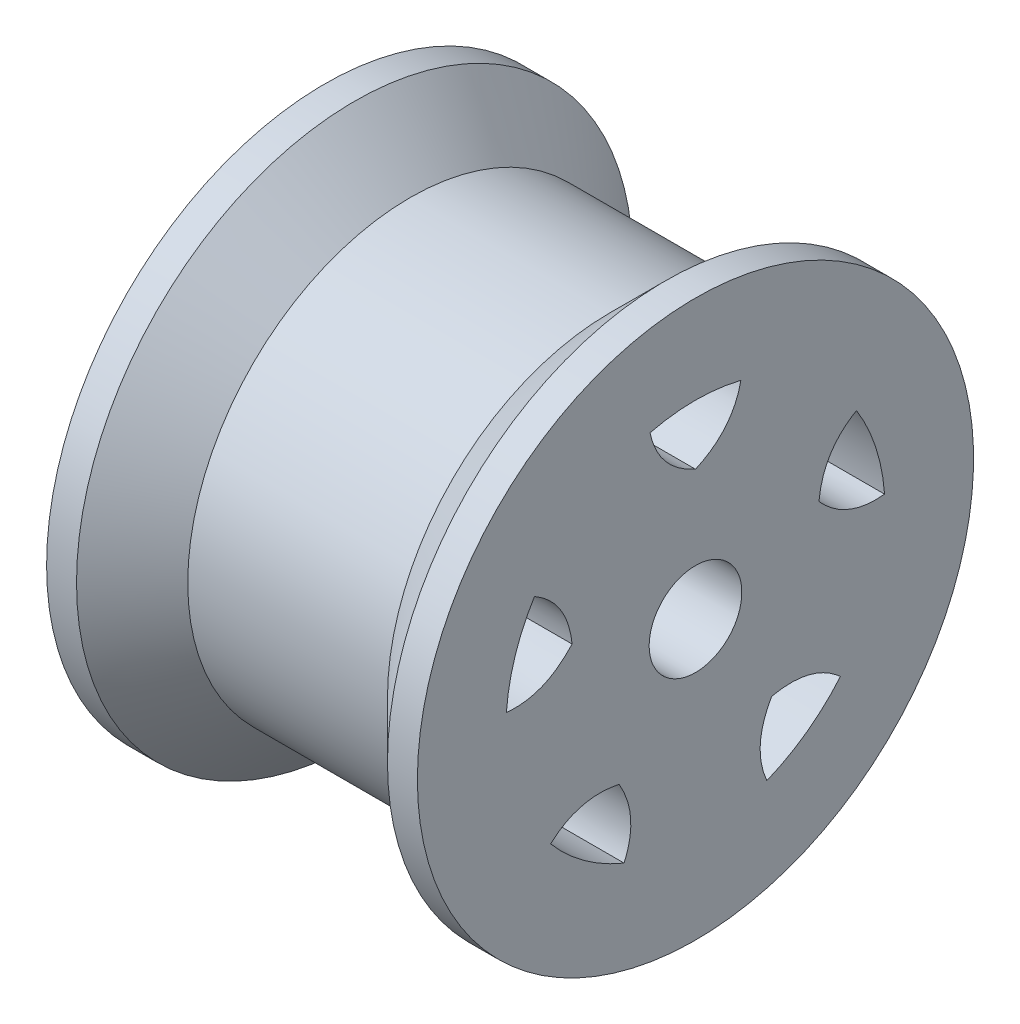
ISO-10303-21;
HEADER;
FILE_DESCRIPTION(('STEP AP214'),'2;1');
FILE_NAME('part.step','',(''),(''),'','','');
FILE_SCHEMA(('AUTOMOTIVE_DESIGN { 1 0 10303 214 1 1 1 1 }'));
ENDSEC;
DATA;
#1=APPLICATION_CONTEXT('core data for automotive mechanical design processes');
#2=APPLICATION_PROTOCOL_DEFINITION('international standard','automotive_design',2000,#1);
#3=PRODUCT_CONTEXT('',#1,'mechanical');
#4=PRODUCT('Part','Part','',(#3));
#5=PRODUCT_RELATED_PRODUCT_CATEGORY('part','',(#4));
#6=PRODUCT_DEFINITION_FORMATION('','',#4);
#7=PRODUCT_DEFINITION_CONTEXT('part definition',#1,'design');
#8=PRODUCT_DEFINITION('design','',#6,#7);
#9=PRODUCT_DEFINITION_SHAPE('','',#8);
#10=(LENGTH_UNIT() NAMED_UNIT(*) SI_UNIT(.MILLI.,.METRE.));
#11=(NAMED_UNIT(*) PLANE_ANGLE_UNIT() SI_UNIT($,.RADIAN.));
#12=(NAMED_UNIT(*) SI_UNIT($,.STERADIAN.) SOLID_ANGLE_UNIT());
#13=UNCERTAINTY_MEASURE_WITH_UNIT(LENGTH_MEASURE(1.E-05),#10,'distance_accuracy_value','');
#14=(GEOMETRIC_REPRESENTATION_CONTEXT(3) GLOBAL_UNCERTAINTY_ASSIGNED_CONTEXT((#13)) GLOBAL_UNIT_ASSIGNED_CONTEXT((#10,
#11,#12)) REPRESENTATION_CONTEXT('',''));
#15=CARTESIAN_POINT('',(0.,0.,0.));
#16=DIRECTION('',(0.,0.,1.));
#17=DIRECTION('',(1.,0.,0.));
#18=AXIS2_PLACEMENT_3D('',#15,#16,#17);
#19=CARTESIAN_POINT('',(2.,7.,0.));
#20=DIRECTION('',(1.,0.,0.));
#21=DIRECTION('',(0.,0.,-1.));
#22=AXIS2_PLACEMENT_3D('',#19,#20,#21);
#23=PLANE('',#22);
#24=CARTESIAN_POINT('',(2.,0.,0.));
#25=DIRECTION('',(-1.,0.,0.));
#26=DIRECTION('',(0.,0.,1.));
#27=AXIS2_PLACEMENT_3D('',#24,#25,#26);
#28=CIRCLE('',#27,7.);
#29=CARTESIAN_POINT('',(2.,2.1631189606247,6.65739561406603));
#30=VERTEX_POINT('',#29);
#31=CARTESIAN_POINT('',(2.,7.,0.));
#32=VERTEX_POINT('',#31);
#33=EDGE_CURVE('E151',#30,#32,#28,.T.);
#34=ORIENTED_EDGE('',*,*,#33,.F.);
#35=CARTESIAN_POINT('',(2.,5.39914971594777,8.68364783590195));
#36=CARTESIAN_POINT('',(2.,4.35907124753092,6.88593037319577));
#37=CARTESIAN_POINT('',(2.,2.1631189606247,6.65739561406603));
#38=B_SPLINE_CURVE_WITH_KNOTS('',2,(#35,#36,#37),.UNSPECIFIED.,.F.,.F.,(3,3),(0.,1.),.UNSPECIFIED.);
#39=CARTESIAN_POINT('',(2.,5.39914971594777,8.68364783590196));
#40=VERTEX_POINT('',#39);
#41=EDGE_CURVE('E130',#40,#30,#38,.T.);
#42=ORIENTED_EDGE('',*,*,#41,.F.);
#43=CARTESIAN_POINT('',(2.,0.,0.));
#44=DIRECTION('',(-1.,0.,0.));
#45=DIRECTION('',(0.,0.,1.));
#46=AXIS2_PLACEMENT_3D('',#43,#44,#45);
#47=CIRCLE('',#46,10.2252900884612);
#48=CARTESIAN_POINT('',(2.,9.92706887694942,2.4515017653442));
#49=VERTEX_POINT('',#48);
#50=EDGE_CURVE('E218',#40,#49,#47,.T.);
#51=ORIENTED_EDGE('',*,*,#50,.T.);
#52=CARTESIAN_POINT('',(2.,7.,0.));
#53=CARTESIAN_POINT('',(2.,7.89593604736084,2.01785360755892));
#54=CARTESIAN_POINT('',(2.,9.92706887694942,2.4515017653442));
#55=B_SPLINE_CURVE_WITH_KNOTS('',2,(#52,#53,#54),.UNSPECIFIED.,.F.,.F.,(3,3),(0.,1.),.UNSPECIFIED.);
#56=EDGE_CURVE('E153',#32,#49,#55,.T.);
#57=ORIENTED_EDGE('',*,*,#56,.F.);
#58=EDGE_LOOP('',(#34,#42,#51,#57));
#59=FACE_BOUND('',#58,.T.);
#60=ADVANCED_FACE('F17',(#59),#23,.F.);
#61=CARTESIAN_POINT('',(2.,-6.59021084214436,7.81829127426617));
#62=VERTEX_POINT('',#61);
#63=CARTESIAN_POINT('',(2.,0.736116258668438,10.1987592503651));
#64=VERTEX_POINT('',#63);
#65=EDGE_CURVE('E148',#62,#64,#47,.T.);
#66=ORIENTED_EDGE('',*,*,#65,.T.);
#67=CARTESIAN_POINT('',(2.,2.1631189606247,6.65739561406603));
#68=CARTESIAN_POINT('',(2.,0.520885602733746,8.13303248698882));
#69=CARTESIAN_POINT('',(2.,0.736116258668438,10.1987592503651));
#70=B_SPLINE_CURVE_WITH_KNOTS('',2,(#67,#68,#69),.UNSPECIFIED.,.F.,.F.,(3,3),(0.,1.),.UNSPECIFIED.);
#71=EDGE_CURVE('E39',#30,#64,#70,.T.);
#72=ORIENTED_EDGE('',*,*,#71,.F.);
#73=CARTESIAN_POINT('',(2.,-5.66311896062458,4.11449676604735));
#74=VERTEX_POINT('',#73);
#75=EDGE_CURVE('E145',#74,#30,#28,.T.);
#76=ORIENTED_EDGE('',*,*,#75,.F.);
#77=CARTESIAN_POINT('',(2.,-6.59021084214435,7.81829127426617));
#78=CARTESIAN_POINT('',(2.,-5.20188185700432,6.27359262235923));
#79=CARTESIAN_POINT('',(2.,-5.66311896062458,4.11449676604735));
#80=B_SPLINE_CURVE_WITH_KNOTS('',2,(#77,#78,#79),.UNSPECIFIED.,.F.,.F.,(3,3),(0.,1.),.UNSPECIFIED.);
#81=EDGE_CURVE('E251',#62,#74,#80,.T.);
#82=ORIENTED_EDGE('',*,*,#81,.F.);
#83=EDGE_LOOP('',(#66,#72,#76,#82));
#84=FACE_BOUND('',#83,.T.);
#85=ADVANCED_FACE('F142',(#84),#23,.F.);
#86=CARTESIAN_POINT('',(2.,-9.47212400942101,-3.85167809445878));
#87=VERTEX_POINT('',#86);
#88=CARTESIAN_POINT('',(2.,-9.47212400942095,3.85167809445892));
#89=VERTEX_POINT('',#88);
#90=EDGE_CURVE('E212',#87,#89,#47,.T.);
#91=ORIENTED_EDGE('',*,*,#90,.T.);
#92=CARTESIAN_POINT('',(2.,-5.66311896062458,4.11449676604735));
#93=CARTESIAN_POINT('',(2.,-7.57401104062094,3.00863690100732));
#94=CARTESIAN_POINT('',(2.,-9.47212400942096,3.85167809445892));
#95=B_SPLINE_CURVE_WITH_KNOTS('',2,(#92,#93,#94),.UNSPECIFIED.,.F.,.F.,(3,3),(0.,1.),.UNSPECIFIED.);
#96=EDGE_CURVE('E432',#74,#89,#95,.T.);
#97=ORIENTED_EDGE('',*,*,#96,.F.);
#98=CARTESIAN_POINT('',(2.,-5.66311896062464,-4.11449676604727));
#99=VERTEX_POINT('',#98);
#100=EDGE_CURVE('E164',#99,#74,#28,.T.);
#101=ORIENTED_EDGE('',*,*,#100,.F.);
#102=CARTESIAN_POINT('',(2.,-9.47212400942101,-3.85167809445878));
#103=CARTESIAN_POINT('',(2.,-7.57401104062098,-3.00863690100722));
#104=CARTESIAN_POINT('',(2.,-5.66311896062464,-4.11449676604727));
#105=B_SPLINE_CURVE_WITH_KNOTS('',2,(#102,#103,#104),.UNSPECIFIED.,.F.,.F.,(3,3),(0.,1.),.UNSPECIFIED.);
#106=EDGE_CURVE('E295',#87,#99,#105,.T.);
#107=ORIENTED_EDGE('',*,*,#106,.F.);
#108=EDGE_LOOP('',(#91,#97,#101,#107));
#109=FACE_BOUND('',#108,.T.);
#110=ADVANCED_FACE('F431',(#109),#23,.F.);
#111=CARTESIAN_POINT('',(2.,0.736116258668295,-10.1987592503651));
#112=VERTEX_POINT('',#111);
#113=CARTESIAN_POINT('',(2.,-6.59021084214447,-7.81829127426608));
#114=VERTEX_POINT('',#113);
#115=EDGE_CURVE('E208',#112,#114,#47,.T.);
#116=ORIENTED_EDGE('',*,*,#115,.T.);
#117=CARTESIAN_POINT('',(2.,-5.66311896062464,-4.11449676604727));
#118=CARTESIAN_POINT('',(2.,-5.20188185700441,-6.27359262235916));
#119=CARTESIAN_POINT('',(2.,-6.59021084214447,-7.81829127426608));
#120=B_SPLINE_CURVE_WITH_KNOTS('',2,(#117,#118,#119),.UNSPECIFIED.,.F.,.F.,(3,3),(0.,1.),.UNSPECIFIED.);
#121=EDGE_CURVE('E303',#99,#114,#120,.T.);
#122=ORIENTED_EDGE('',*,*,#121,.F.);
#123=CARTESIAN_POINT('',(2.,2.16311896062461,-6.65739561406606));
#124=VERTEX_POINT('',#123);
#125=EDGE_CURVE('E165',#124,#99,#28,.T.);
#126=ORIENTED_EDGE('',*,*,#125,.F.);
#127=CARTESIAN_POINT('',(2.,0.736116258668294,-10.1987592503651));
#128=CARTESIAN_POINT('',(2.,0.520885602733631,-8.13303248698883));
#129=CARTESIAN_POINT('',(2.,2.16311896062461,-6.65739561406606));
#130=B_SPLINE_CURVE_WITH_KNOTS('',2,(#127,#128,#129),.UNSPECIFIED.,.F.,.F.,(3,3),(0.,1.),.UNSPECIFIED.);
#131=EDGE_CURVE('E327',#112,#124,#130,.T.);
#132=ORIENTED_EDGE('',*,*,#131,.F.);
#133=EDGE_LOOP('',(#116,#122,#126,#132));
#134=FACE_BOUND('',#133,.T.);
#135=ADVANCED_FACE('F472',(#134),#23,.F.);
#136=CARTESIAN_POINT('',(2.,9.92706887694942,-2.4515017653442));
#137=VERTEX_POINT('',#136);
#138=CARTESIAN_POINT('',(2.,5.39914971594764,-8.68364783590203));
#139=VERTEX_POINT('',#138);
#140=EDGE_CURVE('E197',#137,#139,#47,.T.);
#141=ORIENTED_EDGE('',*,*,#140,.T.);
#142=CARTESIAN_POINT('',(2.,2.16311896062461,-6.65739561406606));
#143=CARTESIAN_POINT('',(2.,4.35907124753082,-6.88593037319584));
#144=CARTESIAN_POINT('',(2.,5.39914971594764,-8.68364783590203));
#145=B_SPLINE_CURVE_WITH_KNOTS('',2,(#142,#143,#144),.UNSPECIFIED.,.F.,.F.,(3,3),(0.,1.),.UNSPECIFIED.);
#146=EDGE_CURVE('E741',#124,#139,#145,.T.);
#147=ORIENTED_EDGE('',*,*,#146,.F.);
#148=EDGE_CURVE('E160',#32,#124,#28,.T.);
#149=ORIENTED_EDGE('',*,*,#148,.F.);
#150=CARTESIAN_POINT('',(2.,9.92706887694942,-2.4515017653442));
#151=CARTESIAN_POINT('',(2.,7.89593604736084,-2.01785360755892));
#152=CARTESIAN_POINT('',(2.,7.,0.));
#153=B_SPLINE_CURVE_WITH_KNOTS('',2,(#150,#151,#152),.UNSPECIFIED.,.F.,.F.,(3,3),(0.,1.),.UNSPECIFIED.);
#154=EDGE_CURVE('E383',#137,#32,#153,.T.);
#155=ORIENTED_EDGE('',*,*,#154,.F.);
#156=EDGE_LOOP('',(#141,#147,#149,#155));
#157=FACE_BOUND('',#156,.T.);
#158=ADVANCED_FACE('F413',(#157),#23,.F.);
#159=CARTESIAN_POINT('',(0.,0.,0.));
#160=DIRECTION('',(-1.,0.,0.));
#161=DIRECTION('',(0.,0.,1.));
#162=AXIS2_PLACEMENT_3D('',#159,#160,#161);
#163=CYLINDRICAL_SURFACE('',#162,15.);
#164=CARTESIAN_POINT('',(0.,0.,0.));
#165=DIRECTION('',(-1.,0.,0.));
#166=DIRECTION('',(0.,0.,1.));
#167=AXIS2_PLACEMENT_3D('',#164,#165,#166);
#168=CIRCLE('',#167,15.);
#169=CARTESIAN_POINT('',(0.,0.,15.));
#170=VERTEX_POINT('',#169);
#171=EDGE_CURVE('E390',#170,#170,#168,.T.);
#172=ORIENTED_EDGE('',*,*,#171,.F.);
#173=EDGE_LOOP('',(#172));
#174=FACE_BOUND('',#173,.T.);
#175=CARTESIAN_POINT('',(1.61417223726469,0.,0.));
#176=DIRECTION('',(-1.,0.,0.));
#177=DIRECTION('',(0.,0.,1.));
#178=AXIS2_PLACEMENT_3D('',#175,#176,#177);
#179=CIRCLE('',#178,15.);
#180=CARTESIAN_POINT('',(1.61417223726469,0.,15.));
#181=VERTEX_POINT('',#180);
#182=EDGE_CURVE('E191',#181,#181,#179,.T.);
#183=ORIENTED_EDGE('',*,*,#182,.T.);
#184=EDGE_LOOP('',(#183));
#185=FACE_BOUND('',#184,.T.);
#186=ADVANCED_FACE('F19',(#174,#185),#163,.T.);
#187=CARTESIAN_POINT('',(4.61417223726469,0.,0.));
#188=DIRECTION('',(-1.,0.,0.));
#189=DIRECTION('',(0.,0.,1.));
#190=AXIS2_PLACEMENT_3D('',#187,#188,#189);
#191=CONICAL_SURFACE('',#190,12.,0.78539816339745);
#192=ORIENTED_EDGE('',*,*,#182,.F.);
#193=EDGE_LOOP('',(#192));
#194=FACE_BOUND('',#193,.T.);
#195=CARTESIAN_POINT('',(4.61417223726469,0.,0.));
#196=DIRECTION('',(-1.,0.,0.));
#197=DIRECTION('',(0.,0.,1.));
#198=AXIS2_PLACEMENT_3D('',#195,#196,#197);
#199=CIRCLE('',#198,12.);
#200=CARTESIAN_POINT('',(4.61417223726469,0.,12.));
#201=VERTEX_POINT('',#200);
#202=EDGE_CURVE('E188',#201,#201,#199,.T.);
#203=ORIENTED_EDGE('',*,*,#202,.T.);
#204=EDGE_LOOP('',(#203));
#205=FACE_BOUND('',#204,.T.);
#206=ADVANCED_FACE('F478',(#194,#205),#191,.T.);
#207=CARTESIAN_POINT('',(0.,0.,0.));
#208=DIRECTION('',(-1.,0.,0.));
#209=DIRECTION('',(0.,0.,1.));
#210=AXIS2_PLACEMENT_3D('',#207,#208,#209);
#211=CYLINDRICAL_SURFACE('',#210,12.);
#212=ORIENTED_EDGE('',*,*,#202,.F.);
#213=EDGE_LOOP('',(#212));
#214=FACE_BOUND('',#213,.T.);
#215=CARTESIAN_POINT('',(15.3858277627353,0.,0.));
#216=DIRECTION('',(-1.,0.,0.));
#217=DIRECTION('',(0.,0.,1.));
#218=AXIS2_PLACEMENT_3D('',#215,#216,#217);
#219=CIRCLE('',#218,12.);
#220=CARTESIAN_POINT('',(15.3858277627353,0.,12.));
#221=VERTEX_POINT('',#220);
#222=EDGE_CURVE('E185',#221,#221,#219,.T.);
#223=ORIENTED_EDGE('',*,*,#222,.T.);
#224=EDGE_LOOP('',(#223));
#225=FACE_BOUND('',#224,.T.);
#226=ADVANCED_FACE('F525',(#214,#225),#211,.T.);
#227=CARTESIAN_POINT('',(18.3858277627353,0.,0.));
#228=DIRECTION('',(1.,0.,0.));
#229=DIRECTION('',(0.,0.,-1.));
#230=AXIS2_PLACEMENT_3D('',#227,#228,#229);
#231=CONICAL_SURFACE('',#230,15.,0.785398163397449);
#232=ORIENTED_EDGE('',*,*,#222,.F.);
#233=EDGE_LOOP('',(#232));
#234=FACE_BOUND('',#233,.T.);
#235=CARTESIAN_POINT('',(18.3858277627353,0.,0.));
#236=DIRECTION('',(-1.,0.,0.));
#237=DIRECTION('',(0.,0.,1.));
#238=AXIS2_PLACEMENT_3D('',#235,#236,#237);
#239=CIRCLE('',#238,15.);
#240=CARTESIAN_POINT('',(18.3858277627353,0.,15.));
#241=VERTEX_POINT('',#240);
#242=EDGE_CURVE('E182',#241,#241,#239,.T.);
#243=ORIENTED_EDGE('',*,*,#242,.T.);
#244=EDGE_LOOP('',(#243));
#245=FACE_BOUND('',#244,.T.);
#246=ADVANCED_FACE('F533',(#234,#245),#231,.T.);
#247=CARTESIAN_POINT('',(0.,0.,0.));
#248=DIRECTION('',(-1.,0.,0.));
#249=DIRECTION('',(0.,0.,1.));
#250=AXIS2_PLACEMENT_3D('',#247,#248,#249);
#251=CYLINDRICAL_SURFACE('',#250,15.);
#252=ORIENTED_EDGE('',*,*,#242,.F.);
#253=EDGE_LOOP('',(#252));
#254=FACE_BOUND('',#253,.T.);
#255=CARTESIAN_POINT('',(20.,0.,0.));
#256=DIRECTION('',(-1.,0.,0.));
#257=DIRECTION('',(0.,0.,1.));
#258=AXIS2_PLACEMENT_3D('',#255,#256,#257);
#259=CIRCLE('',#258,15.);
#260=CARTESIAN_POINT('',(20.,0.,15.));
#261=VERTEX_POINT('',#260);
#262=EDGE_CURVE('E179',#261,#261,#259,.T.);
#263=ORIENTED_EDGE('',*,*,#262,.T.);
#264=EDGE_LOOP('',(#263));
#265=FACE_BOUND('',#264,.T.);
#266=ADVANCED_FACE('F542',(#254,#265),#251,.T.);
#267=CARTESIAN_POINT('',(20.,15.,0.));
#268=DIRECTION('',(-1.,0.,0.));
#269=DIRECTION('',(0.,0.,1.));
#270=AXIS2_PLACEMENT_3D('',#267,#268,#269);
#271=PLANE('',#270);
#272=CARTESIAN_POINT('',(20.,0.,0.));
#273=DIRECTION('',(-1.,0.,0.));
#274=DIRECTION('',(0.,0.,1.));
#275=AXIS2_PLACEMENT_3D('',#272,#273,#274);
#276=CIRCLE('',#275,10.2252900884612);
#277=CARTESIAN_POINT('',(20.,0.736116258668438,10.1987592503651));
#278=VERTEX_POINT('',#277);
#279=CARTESIAN_POINT('',(20.,5.39914971594777,8.68364783590196));
#280=VERTEX_POINT('',#279);
#281=EDGE_CURVE('E246',#278,#280,#276,.T.);
#282=ORIENTED_EDGE('',*,*,#281,.T.);
#283=CARTESIAN_POINT('',(20.,5.39914971594777,8.68364783590195));
#284=CARTESIAN_POINT('',(20.,4.35907124753092,6.88593037319577));
#285=CARTESIAN_POINT('',(20.,2.1631189606247,6.65739561406603));
#286=B_SPLINE_CURVE_WITH_KNOTS('',2,(#283,#284,#285),.UNSPECIFIED.,.F.,.F.,(3,3),(0.,1.),.UNSPECIFIED.);
#287=CARTESIAN_POINT('',(20.,2.1631189606247,6.65739561406603));
#288=VERTEX_POINT('',#287);
#289=EDGE_CURVE('E11',#280,#288,#286,.T.);
#290=ORIENTED_EDGE('',*,*,#289,.T.);
#291=CARTESIAN_POINT('',(20.,2.1631189606247,6.65739561406603));
#292=CARTESIAN_POINT('',(20.,0.520885602733746,8.13303248698882));
#293=CARTESIAN_POINT('',(20.,0.736116258668438,10.1987592503651));
#294=B_SPLINE_CURVE_WITH_KNOTS('',2,(#291,#292,#293),.UNSPECIFIED.,.F.,.F.,(3,3),(0.,1.),.UNSPECIFIED.);
#295=EDGE_CURVE('E27',#288,#278,#294,.T.);
#296=ORIENTED_EDGE('',*,*,#295,.T.);
#297=EDGE_LOOP('',(#282,#290,#296));
#298=FACE_BOUND('',#297,.T.);
#299=CARTESIAN_POINT('',(20.,0.,0.));
#300=DIRECTION('',(-1.,0.,0.));
#301=DIRECTION('',(0.,0.,1.));
#302=AXIS2_PLACEMENT_3D('',#299,#300,#301);
#303=CIRCLE('',#302,10.2252900884612);
#304=CARTESIAN_POINT('',(20.,-9.47212400942096,3.85167809445892));
#305=VERTEX_POINT('',#304);
#306=CARTESIAN_POINT('',(20.,-6.59021084214436,7.81829127426617));
#307=VERTEX_POINT('',#306);
#308=EDGE_CURVE('E304',#305,#307,#303,.T.);
#309=ORIENTED_EDGE('',*,*,#308,.T.);
#310=CARTESIAN_POINT('',(20.,-6.59021084214435,7.81829127426617));
#311=CARTESIAN_POINT('',(20.,-5.20188185700432,6.27359262235923));
#312=CARTESIAN_POINT('',(20.,-5.66311896062458,4.11449676604735));
#313=B_SPLINE_CURVE_WITH_KNOTS('',2,(#310,#311,#312),.UNSPECIFIED.,.F.,.F.,(3,3),(0.,1.),.UNSPECIFIED.);
#314=CARTESIAN_POINT('',(20.,-5.66311896062458,4.11449676604735));
#315=VERTEX_POINT('',#314);
#316=EDGE_CURVE('E227',#307,#315,#313,.T.);
#317=ORIENTED_EDGE('',*,*,#316,.T.);
#318=CARTESIAN_POINT('',(20.,-5.66311896062458,4.11449676604735));
#319=CARTESIAN_POINT('',(20.,-7.57401104062094,3.00863690100732));
#320=CARTESIAN_POINT('',(20.,-9.47212400942096,3.85167809445892));
#321=B_SPLINE_CURVE_WITH_KNOTS('',2,(#318,#319,#320),.UNSPECIFIED.,.F.,.F.,(3,3),(0.,1.),.UNSPECIFIED.);
#322=EDGE_CURVE('E222',#315,#305,#321,.T.);
#323=ORIENTED_EDGE('',*,*,#322,.T.);
#324=EDGE_LOOP('',(#309,#317,#323));
#325=FACE_BOUND('',#324,.T.);
#326=CARTESIAN_POINT('',(20.,0.,0.));
#327=DIRECTION('',(-1.,0.,0.));
#328=DIRECTION('',(0.,0.,1.));
#329=AXIS2_PLACEMENT_3D('',#326,#327,#328);
#330=CIRCLE('',#329,10.2252900884612);
#331=CARTESIAN_POINT('',(20.,-6.59021084214447,-7.81829127426608));
#332=VERTEX_POINT('',#331);
#333=CARTESIAN_POINT('',(20.,-9.47212400942101,-3.85167809445878));
#334=VERTEX_POINT('',#333);
#335=EDGE_CURVE('E320',#332,#334,#330,.T.);
#336=ORIENTED_EDGE('',*,*,#335,.T.);
#337=CARTESIAN_POINT('',(20.,-9.47212400942101,-3.85167809445878));
#338=CARTESIAN_POINT('',(20.,-7.57401104062098,-3.00863690100722));
#339=CARTESIAN_POINT('',(20.,-5.66311896062464,-4.11449676604727));
#340=B_SPLINE_CURVE_WITH_KNOTS('',2,(#337,#338,#339),.UNSPECIFIED.,.F.,.F.,(3,3),(0.,1.),.UNSPECIFIED.);
#341=CARTESIAN_POINT('',(20.,-5.66311896062464,-4.11449676604727));
#342=VERTEX_POINT('',#341);
#343=EDGE_CURVE('E219',#334,#342,#340,.T.);
#344=ORIENTED_EDGE('',*,*,#343,.T.);
#345=CARTESIAN_POINT('',(20.,-5.66311896062464,-4.11449676604727));
#346=CARTESIAN_POINT('',(20.,-5.20188185700441,-6.27359262235916));
#347=CARTESIAN_POINT('',(20.,-6.59021084214447,-7.81829127426608));
#348=B_SPLINE_CURVE_WITH_KNOTS('',2,(#345,#346,#347),.UNSPECIFIED.,.F.,.F.,(3,3),(0.,1.),.UNSPECIFIED.);
#349=EDGE_CURVE('E737',#342,#332,#348,.T.);
#350=ORIENTED_EDGE('',*,*,#349,.T.);
#351=EDGE_LOOP('',(#336,#344,#350));
#352=FACE_BOUND('',#351,.T.);
#353=CARTESIAN_POINT('',(20.,0.,0.));
#354=DIRECTION('',(-1.,0.,0.));
#355=DIRECTION('',(0.,0.,1.));
#356=AXIS2_PLACEMENT_3D('',#353,#354,#355);
#357=CIRCLE('',#356,10.2252900884612);
#358=CARTESIAN_POINT('',(20.,5.39914971594764,-8.68364783590203));
#359=VERTEX_POINT('',#358);
#360=CARTESIAN_POINT('',(20.,0.736116258668295,-10.1987592503651));
#361=VERTEX_POINT('',#360);
#362=EDGE_CURVE('E385',#359,#361,#357,.T.);
#363=ORIENTED_EDGE('',*,*,#362,.T.);
#364=CARTESIAN_POINT('',(20.,0.736116258668294,-10.1987592503651));
#365=CARTESIAN_POINT('',(20.,0.520885602733631,-8.13303248698883));
#366=CARTESIAN_POINT('',(20.,2.16311896062461,-6.65739561406606));
#367=B_SPLINE_CURVE_WITH_KNOTS('',2,(#364,#365,#366),.UNSPECIFIED.,.F.,.F.,(3,3),(0.,1.),.UNSPECIFIED.);
#368=CARTESIAN_POINT('',(20.,2.16311896062461,-6.65739561406606));
#369=VERTEX_POINT('',#368);
#370=EDGE_CURVE('E767',#361,#369,#367,.T.);
#371=ORIENTED_EDGE('',*,*,#370,.T.);
#372=CARTESIAN_POINT('',(20.,2.16311896062461,-6.65739561406606));
#373=CARTESIAN_POINT('',(20.,4.35907124753082,-6.88593037319584));
#374=CARTESIAN_POINT('',(20.,5.39914971594764,-8.68364783590203));
#375=B_SPLINE_CURVE_WITH_KNOTS('',2,(#372,#373,#374),.UNSPECIFIED.,.F.,.F.,(3,3),(0.,1.),.UNSPECIFIED.);
#376=EDGE_CURVE('E194',#369,#359,#375,.T.);
#377=ORIENTED_EDGE('',*,*,#376,.T.);
#378=EDGE_LOOP('',(#363,#371,#377));
#379=FACE_BOUND('',#378,.T.);
#380=CARTESIAN_POINT('',(20.,0.,0.));
#381=DIRECTION('',(-1.,0.,0.));
#382=DIRECTION('',(0.,0.,1.));
#383=AXIS2_PLACEMENT_3D('',#380,#381,#382);
#384=CIRCLE('',#383,10.2252900884612);
#385=CARTESIAN_POINT('',(20.,9.92706887694942,2.4515017653442));
#386=VERTEX_POINT('',#385);
#387=CARTESIAN_POINT('',(20.,9.92706887694942,-2.4515017653442));
#388=VERTEX_POINT('',#387);
#389=EDGE_CURVE('E364',#386,#388,#384,.T.);
#390=ORIENTED_EDGE('',*,*,#389,.T.);
#391=CARTESIAN_POINT('',(20.,9.92706887694942,-2.4515017653442));
#392=CARTESIAN_POINT('',(20.,7.89593604736084,-2.01785360755892));
#393=CARTESIAN_POINT('',(20.,7.,0.));
#394=B_SPLINE_CURVE_WITH_KNOTS('',2,(#391,#392,#393),.UNSPECIFIED.,.F.,.F.,(3,3),(0.,1.),.UNSPECIFIED.);
#395=CARTESIAN_POINT('',(20.,7.,0.));
#396=VERTEX_POINT('',#395);
#397=EDGE_CURVE('E365',#388,#396,#394,.T.);
#398=ORIENTED_EDGE('',*,*,#397,.T.);
#399=CARTESIAN_POINT('',(20.,7.,0.));
#400=CARTESIAN_POINT('',(20.,7.89593604736084,2.01785360755892));
#401=CARTESIAN_POINT('',(20.,9.92706887694942,2.4515017653442));
#402=B_SPLINE_CURVE_WITH_KNOTS('',2,(#399,#400,#401),.UNSPECIFIED.,.F.,.F.,(3,3),(0.,1.),.UNSPECIFIED.);
#403=EDGE_CURVE('E358',#396,#386,#402,.T.);
#404=ORIENTED_EDGE('',*,*,#403,.T.);
#405=EDGE_LOOP('',(#390,#398,#404));
#406=FACE_BOUND('',#405,.T.);
#407=ORIENTED_EDGE('',*,*,#262,.F.);
#408=EDGE_LOOP('',(#407));
#409=FACE_BOUND('',#408,.T.);
#410=CARTESIAN_POINT('',(20.,0.,0.));
#411=DIRECTION('',(-1.,0.,0.));
#412=DIRECTION('',(0.,0.,1.));
#413=AXIS2_PLACEMENT_3D('',#410,#411,#412);
#414=CIRCLE('',#413,2.5);
#415=CARTESIAN_POINT('',(20.,0.,2.5));
#416=VERTEX_POINT('',#415);
#417=EDGE_CURVE('E176',#416,#416,#414,.T.);
#418=ORIENTED_EDGE('',*,*,#417,.T.);
#419=EDGE_LOOP('',(#418));
#420=FACE_BOUND('',#419,.T.);
#421=ADVANCED_FACE('F244',(#298,#325,#352,#379,#406,#409,#420),#271,.F.);
#422=CARTESIAN_POINT('',(0.,0.,0.));
#423=DIRECTION('',(-1.,0.,0.));
#424=DIRECTION('',(0.,0.,1.));
#425=AXIS2_PLACEMENT_3D('',#422,#423,#424);
#426=CYLINDRICAL_SURFACE('',#425,2.5);
#427=ORIENTED_EDGE('',*,*,#417,.F.);
#428=EDGE_LOOP('',(#427));
#429=FACE_BOUND('',#428,.T.);
#430=CARTESIAN_POINT('',(0.,0.,0.));
#431=DIRECTION('',(-1.,0.,0.));
#432=DIRECTION('',(0.,0.,1.));
#433=AXIS2_PLACEMENT_3D('',#430,#431,#432);
#434=CIRCLE('',#433,2.5);
#435=CARTESIAN_POINT('',(0.,0.,2.5));
#436=VERTEX_POINT('',#435);
#437=EDGE_CURVE('E173',#436,#436,#434,.T.);
#438=ORIENTED_EDGE('',*,*,#437,.T.);
#439=EDGE_LOOP('',(#438));
#440=FACE_BOUND('',#439,.T.);
#441=ADVANCED_FACE('F559',(#429,#440),#426,.F.);
#442=CARTESIAN_POINT('',(0.,2.5,0.));
#443=DIRECTION('',(1.,0.,0.));
#444=DIRECTION('',(0.,0.,-1.));
#445=AXIS2_PLACEMENT_3D('',#442,#443,#444);
#446=PLANE('',#445);
#447=ORIENTED_EDGE('',*,*,#437,.F.);
#448=EDGE_LOOP('',(#447));
#449=FACE_BOUND('',#448,.T.);
#450=CARTESIAN_POINT('',(0.,0.,0.));
#451=DIRECTION('',(-1.,0.,0.));
#452=DIRECTION('',(0.,0.,1.));
#453=AXIS2_PLACEMENT_3D('',#450,#451,#452);
#454=CIRCLE('',#453,5.);
#455=CARTESIAN_POINT('',(0.,0.,5.));
#456=VERTEX_POINT('',#455);
#457=EDGE_CURVE('E168',#456,#456,#454,.T.);
#458=ORIENTED_EDGE('',*,*,#457,.T.);
#459=EDGE_LOOP('',(#458));
#460=FACE_BOUND('',#459,.T.);
#461=ADVANCED_FACE('F567',(#449,#460),#446,.F.);
#462=CARTESIAN_POINT('',(2.,0.,0.));
#463=DIRECTION('',(1.,0.,0.));
#464=DIRECTION('',(0.,0.,-1.));
#465=AXIS2_PLACEMENT_3D('',#462,#463,#464);
#466=CONICAL_SURFACE('',#465,7.,0.785398163397443);
#467=ORIENTED_EDGE('',*,*,#457,.F.);
#468=EDGE_LOOP('',(#467));
#469=FACE_BOUND('',#468,.T.);
#470=ORIENTED_EDGE('',*,*,#148,.T.);
#471=ORIENTED_EDGE('',*,*,#125,.T.);
#472=ORIENTED_EDGE('',*,*,#100,.T.);
#473=ORIENTED_EDGE('',*,*,#75,.T.);
#474=ORIENTED_EDGE('',*,*,#33,.T.);
#475=EDGE_LOOP('',(#470,#471,#472,#473,#474));
#476=FACE_BOUND('',#475,.T.);
#477=ADVANCED_FACE('F161',(#469,#476),#466,.T.);
#478=CARTESIAN_POINT('',(0.,0.,0.));
#479=DIRECTION('',(-1.,0.,0.));
#480=DIRECTION('',(0.,0.,1.));
#481=AXIS2_PLACEMENT_3D('',#478,#479,#480);
#482=CONICAL_SURFACE('',#481,12.2252900884612,0.78539816339745);
#483=EDGE_CURVE('E158',#49,#137,#47,.T.);
#484=ORIENTED_EDGE('',*,*,#483,.F.);
#485=ORIENTED_EDGE('',*,*,#50,.F.);
#486=CARTESIAN_POINT('',(2.,0.,0.));
#487=DIRECTION('',(-1.,0.,0.));
#488=DIRECTION('',(0.,-0.95105651629515,0.309016994374958));
#489=AXIS2_PLACEMENT_3D('',#486,#487,#488);
#490=CIRCLE('',#489,10.2252900884612);
#491=EDGE_CURVE('E127',#64,#40,#490,.T.);
#492=ORIENTED_EDGE('',*,*,#491,.F.);
#493=ORIENTED_EDGE('',*,*,#65,.F.);
#494=CARTESIAN_POINT('',(2.,0.,0.));
#495=DIRECTION('',(-1.,0.,0.));
#496=DIRECTION('',(0.,-0.58778525229248,-0.809016994374942));
#497=AXIS2_PLACEMENT_3D('',#494,#495,#496);
#498=CIRCLE('',#497,10.2252900884612);
#499=EDGE_CURVE('E436',#89,#62,#498,.T.);
#500=ORIENTED_EDGE('',*,*,#499,.F.);
#501=ORIENTED_EDGE('',*,*,#90,.F.);
#502=CARTESIAN_POINT('',(2.,0.,0.));
#503=DIRECTION('',(-1.,0.,0.));
#504=DIRECTION('',(0.,0.587785252292469,-0.809016994374951));
#505=AXIS2_PLACEMENT_3D('',#502,#503,#504);
#506=CIRCLE('',#505,10.2252900884612);
#507=EDGE_CURVE('E311',#114,#87,#506,.T.);
#508=ORIENTED_EDGE('',*,*,#507,.F.);
#509=ORIENTED_EDGE('',*,*,#115,.F.);
#510=CARTESIAN_POINT('',(2.,0.,0.));
#511=DIRECTION('',(-1.,0.,0.));
#512=DIRECTION('',(0.,0.951056516295155,0.309016994374945));
#513=AXIS2_PLACEMENT_3D('',#510,#511,#512);
#514=CIRCLE('',#513,10.2252900884612);
#515=EDGE_CURVE('E421',#139,#112,#514,.T.);
#516=ORIENTED_EDGE('',*,*,#515,.F.);
#517=ORIENTED_EDGE('',*,*,#140,.F.);
#518=EDGE_LOOP('',(#484,#485,#492,#493,#500,#501,#508,#509,#516,#517));
#519=FACE_BOUND('',#518,.T.);
#520=CARTESIAN_POINT('',(0.,0.,0.));
#521=DIRECTION('',(-1.,0.,0.));
#522=DIRECTION('',(0.,0.,1.));
#523=AXIS2_PLACEMENT_3D('',#520,#521,#522);
#524=CIRCLE('',#523,12.2252900884612);
#525=CARTESIAN_POINT('',(0.,0.,12.2252900884612));
#526=VERTEX_POINT('',#525);
#527=EDGE_CURVE('E169',#526,#526,#524,.T.);
#528=ORIENTED_EDGE('',*,*,#527,.T.);
#529=EDGE_LOOP('',(#528));
#530=FACE_BOUND('',#529,.T.);
#531=ADVANCED_FACE('F417',(#519,#530),#482,.F.);
#532=CARTESIAN_POINT('',(0.,12.2252900884612,0.));
#533=DIRECTION('',(1.,0.,0.));
#534=DIRECTION('',(0.,0.,-1.));
#535=AXIS2_PLACEMENT_3D('',#532,#533,#534);
#536=PLANE('',#535);
#537=ORIENTED_EDGE('',*,*,#527,.F.);
#538=EDGE_LOOP('',(#537));
#539=FACE_BOUND('',#538,.T.);
#540=ORIENTED_EDGE('',*,*,#171,.T.);
#541=EDGE_LOOP('',(#540));
#542=FACE_BOUND('',#541,.T.);
#543=ADVANCED_FACE('F591',(#539,#542),#536,.F.);
#544=DIRECTION('',(-1.,0.,0.));
#545=VECTOR('',#544,1.);
#546=SURFACE_OF_LINEAR_EXTRUSION('',#394,#545);
#547=ORIENTED_EDGE('',*,*,#154,.T.);
#548=DIRECTION('',(-1.,0.,0.));
#549=VECTOR('',#548,1.);
#550=CARTESIAN_POINT('',(20.,7.,0.));
#551=LINE('',#550,#549);
#552=EDGE_CURVE('E375',#396,#32,#551,.T.);
#553=ORIENTED_EDGE('',*,*,#552,.F.);
#554=ORIENTED_EDGE('',*,*,#397,.F.);
#555=DIRECTION('',(-1.,0.,0.));
#556=VECTOR('',#555,1.);
#557=CARTESIAN_POINT('',(20.,9.92706887694942,-2.4515017653442));
#558=LINE('',#557,#556);
#559=EDGE_CURVE('E388',#388,#137,#558,.T.);
#560=ORIENTED_EDGE('',*,*,#559,.T.);
#561=EDGE_LOOP('',(#547,#553,#554,#560));
#562=FACE_BOUND('',#561,.T.);
#563=ADVANCED_FACE('F350',(#562),#546,.F.);
#564=CARTESIAN_POINT('',(20.,0.,0.));
#565=DIRECTION('',(-1.,0.,0.));
#566=DIRECTION('',(0.,0.,1.));
#567=AXIS2_PLACEMENT_3D('',#564,#565,#566);
#568=CYLINDRICAL_SURFACE('',#567,10.2252900884612);
#569=ORIENTED_EDGE('',*,*,#483,.T.);
#570=ORIENTED_EDGE('',*,*,#559,.F.);
#571=ORIENTED_EDGE('',*,*,#389,.F.);
#572=DIRECTION('',(-1.,0.,0.));
#573=VECTOR('',#572,1.);
#574=CARTESIAN_POINT('',(20.,9.92706887694942,2.4515017653442));
#575=LINE('',#574,#573);
#576=EDGE_CURVE('E391',#386,#49,#575,.T.);
#577=ORIENTED_EDGE('',*,*,#576,.T.);
#578=EDGE_LOOP('',(#569,#570,#571,#577));
#579=FACE_BOUND('',#578,.T.);
#580=ADVANCED_FACE('F347',(#579),#568,.F.);
#581=DIRECTION('',(-1.,0.,0.));
#582=VECTOR('',#581,1.);
#583=SURFACE_OF_LINEAR_EXTRUSION('',#402,#582);
#584=ORIENTED_EDGE('',*,*,#56,.T.);
#585=ORIENTED_EDGE('',*,*,#576,.F.);
#586=ORIENTED_EDGE('',*,*,#403,.F.);
#587=ORIENTED_EDGE('',*,*,#552,.T.);
#588=EDGE_LOOP('',(#584,#585,#586,#587));
#589=FACE_BOUND('',#588,.T.);
#590=ADVANCED_FACE('F345',(#589),#583,.F.);
#591=CARTESIAN_POINT('',(20.000025,0.736116258668294,-10.1987592503651));
#592=CARTESIAN_POINT('',(20.000025,0.520885602733631,-8.13303248698883));
#593=CARTESIAN_POINT('',(20.000025,2.16311896062461,-6.65739561406606));
#594=B_SPLINE_CURVE_WITH_KNOTS('',2,(#591,#592,#593),.UNSPECIFIED.,.F.,.F.,(3,3),(0.,1.),.UNSPECIFIED.);
#595=DIRECTION('',(-1.,0.,0.));
#596=VECTOR('',#595,1.);
#597=SURFACE_OF_LINEAR_EXTRUSION('',#594,#596);
#598=DIRECTION('',(-1.,0.,0.));
#599=VECTOR('',#598,1.);
#600=CARTESIAN_POINT('',(20.000025,0.736116258668295,-10.1987592503651));
#601=LINE('',#600,#599);
#602=EDGE_CURVE('E756',#361,#112,#601,.T.);
#603=ORIENTED_EDGE('',*,*,#602,.T.);
#604=ORIENTED_EDGE('',*,*,#131,.T.);
#605=DIRECTION('',(-1.,0.,0.));
#606=VECTOR('',#605,1.);
#607=CARTESIAN_POINT('',(20.000025,2.16311896062461,-6.65739561406606));
#608=LINE('',#607,#606);
#609=EDGE_CURVE('E755',#369,#124,#608,.T.);
#610=ORIENTED_EDGE('',*,*,#609,.F.);
#611=ORIENTED_EDGE('',*,*,#370,.F.);
#612=EDGE_LOOP('',(#603,#604,#610,#611));
#613=FACE_BOUND('',#612,.T.);
#614=ADVANCED_FACE('F340',(#613),#597,.F.);
#615=CARTESIAN_POINT('',(20.000025,2.16311896062461,-6.65739561406606));
#616=CARTESIAN_POINT('',(20.000025,4.35907124753082,-6.88593037319584));
#617=CARTESIAN_POINT('',(20.000025,5.39914971594764,-8.68364783590203));
#618=B_SPLINE_CURVE_WITH_KNOTS('',2,(#615,#616,#617),.UNSPECIFIED.,.F.,.F.,(3,3),(0.,1.),.UNSPECIFIED.);
#619=DIRECTION('',(-1.,0.,0.));
#620=VECTOR('',#619,1.);
#621=SURFACE_OF_LINEAR_EXTRUSION('',#618,#620);
#622=ORIENTED_EDGE('',*,*,#609,.T.);
#623=ORIENTED_EDGE('',*,*,#146,.T.);
#624=DIRECTION('',(-1.,0.,0.));
#625=VECTOR('',#624,1.);
#626=CARTESIAN_POINT('',(20.000025,5.39914971594764,-8.68364783590203));
#627=LINE('',#626,#625);
#628=EDGE_CURVE('E758',#359,#139,#627,.T.);
#629=ORIENTED_EDGE('',*,*,#628,.F.);
#630=ORIENTED_EDGE('',*,*,#376,.F.);
#631=EDGE_LOOP('',(#622,#623,#629,#630));
#632=FACE_BOUND('',#631,.T.);
#633=ADVANCED_FACE('F344',(#632),#621,.F.);
#634=CARTESIAN_POINT('',(20.000025,0.,0.));
#635=DIRECTION('',(-1.,0.,0.));
#636=DIRECTION('',(0.,0.,1.));
#637=AXIS2_PLACEMENT_3D('',#634,#635,#636);
#638=CYLINDRICAL_SURFACE('',#637,10.2252900884612);
#639=ORIENTED_EDGE('',*,*,#628,.T.);
#640=ORIENTED_EDGE('',*,*,#515,.T.);
#641=ORIENTED_EDGE('',*,*,#602,.F.);
#642=ORIENTED_EDGE('',*,*,#362,.F.);
#643=EDGE_LOOP('',(#639,#640,#641,#642));
#644=FACE_BOUND('',#643,.T.);
#645=ADVANCED_FACE('F625',(#644),#638,.F.);
#646=CARTESIAN_POINT('',(20.000025,-9.47212400942101,-3.85167809445878));
#647=CARTESIAN_POINT('',(20.000025,-7.57401104062098,-3.00863690100722));
#648=CARTESIAN_POINT('',(20.000025,-5.66311896062464,-4.11449676604727));
#649=B_SPLINE_CURVE_WITH_KNOTS('',2,(#646,#647,#648),.UNSPECIFIED.,.F.,.F.,(3,3),(0.,1.),.UNSPECIFIED.);
#650=DIRECTION('',(-1.,0.,0.));
#651=VECTOR('',#650,1.);
#652=SURFACE_OF_LINEAR_EXTRUSION('',#649,#651);
#653=DIRECTION('',(-1.,0.,0.));
#654=VECTOR('',#653,1.);
#655=CARTESIAN_POINT('',(20.000025,-9.47212400942101,-3.85167809445878));
#656=LINE('',#655,#654);
#657=EDGE_CURVE('E318',#334,#87,#656,.T.);
#658=ORIENTED_EDGE('',*,*,#657,.T.);
#659=ORIENTED_EDGE('',*,*,#106,.T.);
#660=DIRECTION('',(-1.,0.,0.));
#661=VECTOR('',#660,1.);
#662=CARTESIAN_POINT('',(20.000025,-5.66311896062464,-4.11449676604727));
#663=LINE('',#662,#661);
#664=EDGE_CURVE('E317',#342,#99,#663,.T.);
#665=ORIENTED_EDGE('',*,*,#664,.F.);
#666=ORIENTED_EDGE('',*,*,#343,.F.);
#667=EDGE_LOOP('',(#658,#659,#665,#666));
#668=FACE_BOUND('',#667,.T.);
#669=ADVANCED_FACE('F283',(#668),#652,.F.);
#670=CARTESIAN_POINT('',(20.000025,-5.66311896062464,-4.11449676604727));
#671=CARTESIAN_POINT('',(20.000025,-5.20188185700441,-6.27359262235916));
#672=CARTESIAN_POINT('',(20.000025,-6.59021084214447,-7.81829127426608));
#673=B_SPLINE_CURVE_WITH_KNOTS('',2,(#670,#671,#672),.UNSPECIFIED.,.F.,.F.,(3,3),(0.,1.),.UNSPECIFIED.);
#674=DIRECTION('',(-1.,0.,0.));
#675=VECTOR('',#674,1.);
#676=SURFACE_OF_LINEAR_EXTRUSION('',#673,#675);
#677=ORIENTED_EDGE('',*,*,#664,.T.);
#678=ORIENTED_EDGE('',*,*,#121,.T.);
#679=DIRECTION('',(-1.,0.,0.));
#680=VECTOR('',#679,1.);
#681=CARTESIAN_POINT('',(20.000025,-6.59021084214447,-7.81829127426608));
#682=LINE('',#681,#680);
#683=EDGE_CURVE('E321',#332,#114,#682,.T.);
#684=ORIENTED_EDGE('',*,*,#683,.F.);
#685=ORIENTED_EDGE('',*,*,#349,.F.);
#686=EDGE_LOOP('',(#677,#678,#684,#685));
#687=FACE_BOUND('',#686,.T.);
#688=ADVANCED_FACE('F278',(#687),#676,.F.);
#689=CARTESIAN_POINT('',(20.000025,0.,0.));
#690=DIRECTION('',(-1.,0.,0.));
#691=DIRECTION('',(0.,0.,1.));
#692=AXIS2_PLACEMENT_3D('',#689,#690,#691);
#693=CYLINDRICAL_SURFACE('',#692,10.2252900884612);
#694=ORIENTED_EDGE('',*,*,#683,.T.);
#695=ORIENTED_EDGE('',*,*,#507,.T.);
#696=ORIENTED_EDGE('',*,*,#657,.F.);
#697=ORIENTED_EDGE('',*,*,#335,.F.);
#698=EDGE_LOOP('',(#694,#695,#696,#697));
#699=FACE_BOUND('',#698,.T.);
#700=ADVANCED_FACE('F273',(#699),#693,.F.);
#701=CARTESIAN_POINT('',(20.000025,-6.59021084214435,7.81829127426617));
#702=CARTESIAN_POINT('',(20.000025,-5.20188185700432,6.27359262235923));
#703=CARTESIAN_POINT('',(20.000025,-5.66311896062458,4.11449676604735));
#704=B_SPLINE_CURVE_WITH_KNOTS('',2,(#701,#702,#703),.UNSPECIFIED.,.F.,.F.,(3,3),(0.,1.),.UNSPECIFIED.);
#705=DIRECTION('',(-1.,0.,0.));
#706=VECTOR('',#705,1.);
#707=SURFACE_OF_LINEAR_EXTRUSION('',#704,#706);
#708=DIRECTION('',(-1.,0.,0.));
#709=VECTOR('',#708,1.);
#710=CARTESIAN_POINT('',(20.000025,-6.59021084214436,7.81829127426617));
#711=LINE('',#710,#709);
#712=EDGE_CURVE('E448',#307,#62,#711,.T.);
#713=ORIENTED_EDGE('',*,*,#712,.T.);
#714=ORIENTED_EDGE('',*,*,#81,.T.);
#715=DIRECTION('',(-1.,0.,0.));
#716=VECTOR('',#715,1.);
#717=CARTESIAN_POINT('',(20.000025,-5.66311896062458,4.11449676604735));
#718=LINE('',#717,#716);
#719=EDGE_CURVE('E440',#315,#74,#718,.T.);
#720=ORIENTED_EDGE('',*,*,#719,.F.);
#721=ORIENTED_EDGE('',*,*,#316,.F.);
#722=EDGE_LOOP('',(#713,#714,#720,#721));
#723=FACE_BOUND('',#722,.T.);
#724=ADVANCED_FACE('F268',(#723),#707,.F.);
#725=CARTESIAN_POINT('',(20.000025,-5.66311896062458,4.11449676604735));
#726=CARTESIAN_POINT('',(20.000025,-7.57401104062094,3.00863690100732));
#727=CARTESIAN_POINT('',(20.000025,-9.47212400942096,3.85167809445892));
#728=B_SPLINE_CURVE_WITH_KNOTS('',2,(#725,#726,#727),.UNSPECIFIED.,.F.,.F.,(3,3),(0.,1.),.UNSPECIFIED.);
#729=DIRECTION('',(-1.,0.,0.));
#730=VECTOR('',#729,1.);
#731=SURFACE_OF_LINEAR_EXTRUSION('',#728,#730);
#732=ORIENTED_EDGE('',*,*,#719,.T.);
#733=ORIENTED_EDGE('',*,*,#96,.T.);
#734=DIRECTION('',(-1.,0.,0.));
#735=VECTOR('',#734,1.);
#736=CARTESIAN_POINT('',(20.000025,-9.47212400942096,3.85167809445892));
#737=LINE('',#736,#735);
#738=EDGE_CURVE('E442',#305,#89,#737,.T.);
#739=ORIENTED_EDGE('',*,*,#738,.F.);
#740=ORIENTED_EDGE('',*,*,#322,.F.);
#741=EDGE_LOOP('',(#732,#733,#739,#740));
#742=FACE_BOUND('',#741,.T.);
#743=ADVANCED_FACE('F272',(#742),#731,.F.);
#744=CARTESIAN_POINT('',(20.000025,0.,0.));
#745=DIRECTION('',(-1.,0.,0.));
#746=DIRECTION('',(0.,0.,1.));
#747=AXIS2_PLACEMENT_3D('',#744,#745,#746);
#748=CYLINDRICAL_SURFACE('',#747,10.2252900884612);
#749=ORIENTED_EDGE('',*,*,#738,.T.);
#750=ORIENTED_EDGE('',*,*,#499,.T.);
#751=ORIENTED_EDGE('',*,*,#712,.F.);
#752=ORIENTED_EDGE('',*,*,#308,.F.);
#753=EDGE_LOOP('',(#749,#750,#751,#752));
#754=FACE_BOUND('',#753,.T.);
#755=ADVANCED_FACE('F453',(#754),#748,.F.);
#756=CARTESIAN_POINT('',(20.000025,5.39914971594777,8.68364783590195));
#757=CARTESIAN_POINT('',(20.000025,4.35907124753092,6.88593037319577));
#758=CARTESIAN_POINT('',(20.000025,2.1631189606247,6.65739561406603));
#759=B_SPLINE_CURVE_WITH_KNOTS('',2,(#756,#757,#758),.UNSPECIFIED.,.F.,.F.,(3,3),(0.,1.),.UNSPECIFIED.);
#760=DIRECTION('',(-1.,0.,0.));
#761=VECTOR('',#760,1.);
#762=SURFACE_OF_LINEAR_EXTRUSION('',#759,#761);
#763=DIRECTION('',(-1.,0.,0.));
#764=VECTOR('',#763,1.);
#765=CARTESIAN_POINT('',(20.000025,5.39914971594777,8.68364783590196));
#766=LINE('',#765,#764);
#767=EDGE_CURVE('E133',#280,#40,#766,.T.);
#768=ORIENTED_EDGE('',*,*,#767,.T.);
#769=ORIENTED_EDGE('',*,*,#41,.T.);
#770=DIRECTION('',(-1.,0.,0.));
#771=VECTOR('',#770,1.);
#772=CARTESIAN_POINT('',(20.000025,2.1631189606247,6.65739561406603));
#773=LINE('',#772,#771);
#774=EDGE_CURVE('E122',#288,#30,#773,.T.);
#775=ORIENTED_EDGE('',*,*,#774,.F.);
#776=ORIENTED_EDGE('',*,*,#289,.F.);
#777=EDGE_LOOP('',(#768,#769,#775,#776));
#778=FACE_BOUND('',#777,.T.);
#779=ADVANCED_FACE('F131',(#778),#762,.F.);
#780=CARTESIAN_POINT('',(20.000025,2.1631189606247,6.65739561406603));
#781=CARTESIAN_POINT('',(20.000025,0.520885602733746,8.13303248698882));
#782=CARTESIAN_POINT('',(20.000025,0.736116258668438,10.1987592503651));
#783=B_SPLINE_CURVE_WITH_KNOTS('',2,(#780,#781,#782),.UNSPECIFIED.,.F.,.F.,(3,3),(0.,1.),.UNSPECIFIED.);
#784=DIRECTION('',(-1.,0.,0.));
#785=VECTOR('',#784,1.);
#786=SURFACE_OF_LINEAR_EXTRUSION('',#783,#785);
#787=ORIENTED_EDGE('',*,*,#774,.T.);
#788=ORIENTED_EDGE('',*,*,#71,.T.);
#789=DIRECTION('',(-1.,0.,0.));
#790=VECTOR('',#789,1.);
#791=CARTESIAN_POINT('',(20.000025,0.736116258668438,10.1987592503651));
#792=LINE('',#791,#790);
#793=EDGE_CURVE('E34',#278,#64,#792,.T.);
#794=ORIENTED_EDGE('',*,*,#793,.F.);
#795=ORIENTED_EDGE('',*,*,#295,.F.);
#796=EDGE_LOOP('',(#787,#788,#794,#795));
#797=FACE_BOUND('',#796,.T.);
#798=ADVANCED_FACE('F124',(#797),#786,.F.);
#799=CARTESIAN_POINT('',(20.000025,0.,0.));
#800=DIRECTION('',(-1.,0.,0.));
#801=DIRECTION('',(0.,0.,1.));
#802=AXIS2_PLACEMENT_3D('',#799,#800,#801);
#803=CYLINDRICAL_SURFACE('',#802,10.2252900884612);
#804=ORIENTED_EDGE('',*,*,#793,.T.);
#805=ORIENTED_EDGE('',*,*,#491,.T.);
#806=ORIENTED_EDGE('',*,*,#767,.F.);
#807=ORIENTED_EDGE('',*,*,#281,.F.);
#808=EDGE_LOOP('',(#804,#805,#806,#807));
#809=FACE_BOUND('',#808,.T.);
#810=ADVANCED_FACE('F248',(#809),#803,.F.);
#811=CLOSED_SHELL('',(#60,#85,#110,#135,#158,#186,#206,#226,#246,#266,#421,#441,#461,#477,#531,
#543,#563,#580,#590,#614,#633,#645,#669,#688,#700,#724,#743,#755,#779,#798,#810));
#812=MANIFOLD_SOLID_BREP('B1',#811);
#813=ADVANCED_BREP_SHAPE_REPRESENTATION('',(#18,#812),#14);
#814=SHAPE_DEFINITION_REPRESENTATION(#9,#813);
ENDSEC;
END-ISO-10303-21;
